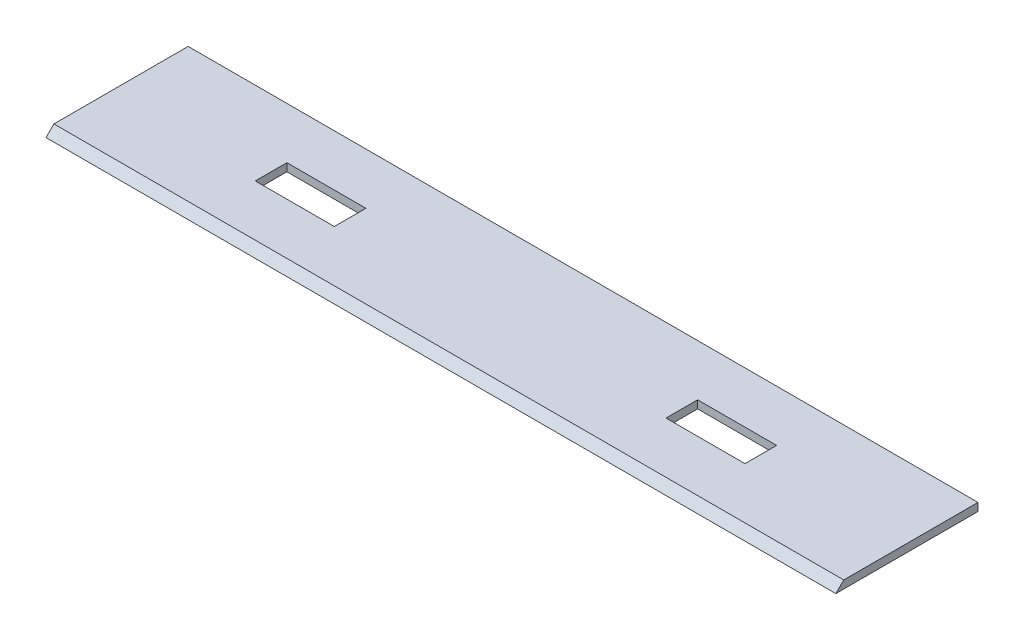
ISO-10303-21;
HEADER;
FILE_DESCRIPTION(('STEP AP214'),'2;1');
FILE_NAME('part.step','',(''),(''),'','','');
FILE_SCHEMA(('AUTOMOTIVE_DESIGN { 1 0 10303 214 1 1 1 1 }'));
ENDSEC;
DATA;
#1=APPLICATION_CONTEXT('core data for automotive mechanical design processes');
#2=APPLICATION_PROTOCOL_DEFINITION('international standard','automotive_design',2000,#1);
#3=PRODUCT_CONTEXT('',#1,'mechanical');
#4=PRODUCT('Part','Part','',(#3));
#5=PRODUCT_RELATED_PRODUCT_CATEGORY('part','',(#4));
#6=PRODUCT_DEFINITION_FORMATION('','',#4);
#7=PRODUCT_DEFINITION_CONTEXT('part definition',#1,'design');
#8=PRODUCT_DEFINITION('design','',#6,#7);
#9=PRODUCT_DEFINITION_SHAPE('','',#8);
#10=(LENGTH_UNIT() NAMED_UNIT(*) SI_UNIT(.MILLI.,.METRE.));
#11=(NAMED_UNIT(*) PLANE_ANGLE_UNIT() SI_UNIT($,.RADIAN.));
#12=(NAMED_UNIT(*) SI_UNIT($,.STERADIAN.) SOLID_ANGLE_UNIT());
#13=UNCERTAINTY_MEASURE_WITH_UNIT(LENGTH_MEASURE(1.E-05),#10,'distance_accuracy_value','');
#14=(GEOMETRIC_REPRESENTATION_CONTEXT(3) GLOBAL_UNCERTAINTY_ASSIGNED_CONTEXT((#13)) GLOBAL_UNIT_ASSIGNED_CONTEXT((#10,
#11,#12)) REPRESENTATION_CONTEXT('',''));
#15=CARTESIAN_POINT('',(0.,0.,0.));
#16=DIRECTION('',(0.,0.,1.));
#17=DIRECTION('',(1.,0.,0.));
#18=AXIS2_PLACEMENT_3D('',#15,#16,#17);
#19=CARTESIAN_POINT('',(50.,1.,9.));
#20=DIRECTION('',(-1.,0.,0.));
#21=DIRECTION('',(0.,0.,1.));
#22=AXIS2_PLACEMENT_3D('',#19,#20,#21);
#23=PLANE('',#22);
#24=DIRECTION('',(0.,0.,-1.));
#25=VECTOR('',#24,1.);
#26=CARTESIAN_POINT('',(50.,1.,9.));
#27=LINE('',#26,#25);
#28=CARTESIAN_POINT('',(50.,1.,8.));
#29=VERTEX_POINT('',#28);
#30=CARTESIAN_POINT('',(50.,1.,-9.));
#31=VERTEX_POINT('',#30);
#32=EDGE_CURVE('E193',#29,#31,#27,.T.);
#33=ORIENTED_EDGE('',*,*,#32,.F.);
#34=DIRECTION('',(0.,0.707106781186548,-0.707106781186548));
#35=VECTOR('',#34,1.);
#36=CARTESIAN_POINT('',(50.,1.,8.));
#37=LINE('',#36,#35);
#38=CARTESIAN_POINT('',(50.,0.,9.));
#39=VERTEX_POINT('',#38);
#40=EDGE_CURVE('E43',#29,#39,#37,.F.);
#41=ORIENTED_EDGE('',*,*,#40,.T.);
#42=DIRECTION('',(0.,0.,-1.));
#43=VECTOR('',#42,1.);
#44=CARTESIAN_POINT('',(50.,0.,9.));
#45=LINE('',#44,#43);
#46=CARTESIAN_POINT('',(50.,0.,-9.));
#47=VERTEX_POINT('',#46);
#48=EDGE_CURVE('E160',#39,#47,#45,.T.);
#49=ORIENTED_EDGE('',*,*,#48,.T.);
#50=DIRECTION('',(0.,-1.,0.));
#51=VECTOR('',#50,1.);
#52=CARTESIAN_POINT('',(50.,1.,-9.));
#53=LINE('',#52,#51);
#54=EDGE_CURVE('E212',#31,#47,#53,.T.);
#55=ORIENTED_EDGE('',*,*,#54,.F.);
#56=EDGE_LOOP('',(#33,#41,#49,#55));
#57=FACE_BOUND('',#56,.T.);
#58=ADVANCED_FACE('F35',(#57),#23,.F.);
#59=CARTESIAN_POINT('',(-50.,1.,-9.));
#60=DIRECTION('',(0.,0.,1.));
#61=DIRECTION('',(1.,0.,0.));
#62=AXIS2_PLACEMENT_3D('',#59,#60,#61);
#63=PLANE('',#62);
#64=DIRECTION('',(-1.,0.,0.));
#65=VECTOR('',#64,1.);
#66=CARTESIAN_POINT('',(-50.,0.,-9.));
#67=LINE('',#66,#65);
#68=CARTESIAN_POINT('',(-50.,0.,-9.));
#69=VERTEX_POINT('',#68);
#70=EDGE_CURVE('E204',#47,#69,#67,.T.);
#71=ORIENTED_EDGE('',*,*,#70,.T.);
#72=DIRECTION('',(0.,-1.,0.));
#73=VECTOR('',#72,1.);
#74=CARTESIAN_POINT('',(-50.,1.,-9.));
#75=LINE('',#74,#73);
#76=CARTESIAN_POINT('',(-50.,1.,-9.));
#77=VERTEX_POINT('',#76);
#78=EDGE_CURVE('E201',#77,#69,#75,.T.);
#79=ORIENTED_EDGE('',*,*,#78,.F.);
#80=DIRECTION('',(-1.,0.,0.));
#81=VECTOR('',#80,1.);
#82=CARTESIAN_POINT('',(-50.,1.,-9.));
#83=LINE('',#82,#81);
#84=EDGE_CURVE('E195',#31,#77,#83,.T.);
#85=ORIENTED_EDGE('',*,*,#84,.F.);
#86=ORIENTED_EDGE('',*,*,#54,.T.);
#87=EDGE_LOOP('',(#71,#79,#85,#86));
#88=FACE_BOUND('',#87,.T.);
#89=ADVANCED_FACE('F235',(#88),#63,.F.);
#90=CARTESIAN_POINT('',(-50.,1.,9.));
#91=DIRECTION('',(1.,0.,0.));
#92=DIRECTION('',(0.,0.,-1.));
#93=AXIS2_PLACEMENT_3D('',#90,#91,#92);
#94=PLANE('',#93);
#95=DIRECTION('',(0.,0.,1.));
#96=VECTOR('',#95,1.);
#97=CARTESIAN_POINT('',(-50.,0.,9.));
#98=LINE('',#97,#96);
#99=CARTESIAN_POINT('',(-50.,0.,9.));
#100=VERTEX_POINT('',#99);
#101=EDGE_CURVE('E206',#69,#100,#98,.T.);
#102=ORIENTED_EDGE('',*,*,#101,.T.);
#103=DIRECTION('',(0.,-0.707106781186548,0.707106781186548));
#104=VECTOR('',#103,1.);
#105=CARTESIAN_POINT('',(-50.,1.,8.));
#106=LINE('',#105,#104);
#107=CARTESIAN_POINT('',(-50.,1.,8.));
#108=VERTEX_POINT('',#107);
#109=EDGE_CURVE('E11',#100,#108,#106,.F.);
#110=ORIENTED_EDGE('',*,*,#109,.T.);
#111=DIRECTION('',(0.,0.,1.));
#112=VECTOR('',#111,1.);
#113=CARTESIAN_POINT('',(-50.,1.,9.));
#114=LINE('',#113,#112);
#115=EDGE_CURVE('E198',#77,#108,#114,.T.);
#116=ORIENTED_EDGE('',*,*,#115,.F.);
#117=ORIENTED_EDGE('',*,*,#78,.T.);
#118=EDGE_LOOP('',(#102,#110,#116,#117));
#119=FACE_BOUND('',#118,.T.);
#120=ADVANCED_FACE('F229',(#119),#94,.F.);
#121=CARTESIAN_POINT('',(0.,1.,0.));
#122=DIRECTION('',(0.,-1.,0.));
#123=DIRECTION('',(0.,0.,-1.));
#124=AXIS2_PLACEMENT_3D('',#121,#122,#123);
#125=PLANE('',#124);
#126=DIRECTION('',(-1.,0.,0.));
#127=VECTOR('',#126,1.);
#128=CARTESIAN_POINT('',(-31.,1.,-2.50000000000001));
#129=LINE('',#128,#127);
#130=CARTESIAN_POINT('',(-21.,1.,-2.50000000000001));
#131=VERTEX_POINT('',#130);
#132=CARTESIAN_POINT('',(-31.,1.,-2.50000000000001));
#133=VERTEX_POINT('',#132);
#134=EDGE_CURVE('E153',#131,#133,#129,.T.);
#135=ORIENTED_EDGE('',*,*,#134,.F.);
#136=DIRECTION('',(0.,0.,-1.));
#137=VECTOR('',#136,1.);
#138=CARTESIAN_POINT('',(-21.,1.,-2.50000000000001));
#139=LINE('',#138,#137);
#140=CARTESIAN_POINT('',(-21.,1.,1.49999999999999));
#141=VERTEX_POINT('',#140);
#142=EDGE_CURVE('E50',#141,#131,#139,.T.);
#143=ORIENTED_EDGE('',*,*,#142,.F.);
#144=DIRECTION('',(1.,0.,0.));
#145=VECTOR('',#144,1.);
#146=CARTESIAN_POINT('',(-31.,1.,1.49999999999999));
#147=LINE('',#146,#145);
#148=CARTESIAN_POINT('',(-31.,1.,1.49999999999999));
#149=VERTEX_POINT('',#148);
#150=EDGE_CURVE('E144',#149,#141,#147,.T.);
#151=ORIENTED_EDGE('',*,*,#150,.F.);
#152=DIRECTION('',(0.,0.,1.));
#153=VECTOR('',#152,1.);
#154=CARTESIAN_POINT('',(-31.,1.,-2.50000000000001));
#155=LINE('',#154,#153);
#156=EDGE_CURVE('E147',#133,#149,#155,.T.);
#157=ORIENTED_EDGE('',*,*,#156,.F.);
#158=EDGE_LOOP('',(#135,#143,#151,#157));
#159=FACE_BOUND('',#158,.T.);
#160=DIRECTION('',(-1.,0.,0.));
#161=VECTOR('',#160,1.);
#162=CARTESIAN_POINT('',(21.,1.,-2.50000000000001));
#163=LINE('',#162,#161);
#164=CARTESIAN_POINT('',(31.,1.,-2.50000000000001));
#165=VERTEX_POINT('',#164);
#166=CARTESIAN_POINT('',(21.,1.,-2.50000000000001));
#167=VERTEX_POINT('',#166);
#168=EDGE_CURVE('E179',#165,#167,#163,.T.);
#169=ORIENTED_EDGE('',*,*,#168,.F.);
#170=DIRECTION('',(0.,0.,-1.));
#171=VECTOR('',#170,1.);
#172=CARTESIAN_POINT('',(31.,1.,-2.50000000000001));
#173=LINE('',#172,#171);
#174=CARTESIAN_POINT('',(31.,1.,1.49999999999999));
#175=VERTEX_POINT('',#174);
#176=EDGE_CURVE('E58',#175,#165,#173,.T.);
#177=ORIENTED_EDGE('',*,*,#176,.F.);
#178=DIRECTION('',(1.,0.,0.));
#179=VECTOR('',#178,1.);
#180=CARTESIAN_POINT('',(21.,1.,1.49999999999999));
#181=LINE('',#180,#179);
#182=CARTESIAN_POINT('',(21.,1.,1.49999999999999));
#183=VERTEX_POINT('',#182);
#184=EDGE_CURVE('E168',#183,#175,#181,.T.);
#185=ORIENTED_EDGE('',*,*,#184,.F.);
#186=DIRECTION('',(0.,0.,1.));
#187=VECTOR('',#186,1.);
#188=CARTESIAN_POINT('',(21.,1.,-2.50000000000001));
#189=LINE('',#188,#187);
#190=EDGE_CURVE('E182',#167,#183,#189,.T.);
#191=ORIENTED_EDGE('',*,*,#190,.F.);
#192=EDGE_LOOP('',(#169,#177,#185,#191));
#193=FACE_BOUND('',#192,.T.);
#194=ORIENTED_EDGE('',*,*,#115,.T.);
#195=DIRECTION('',(1.,0.,0.));
#196=VECTOR('',#195,1.);
#197=CARTESIAN_POINT('',(0.,1.,8.));
#198=LINE('',#197,#196);
#199=EDGE_CURVE('E215',#108,#29,#198,.T.);
#200=ORIENTED_EDGE('',*,*,#199,.T.);
#201=ORIENTED_EDGE('',*,*,#32,.T.);
#202=ORIENTED_EDGE('',*,*,#84,.T.);
#203=EDGE_LOOP('',(#194,#200,#201,#202));
#204=FACE_BOUND('',#203,.T.);
#205=ADVANCED_FACE('F231',(#159,#193,#204),#125,.F.);
#206=CARTESIAN_POINT('',(0.,0.,0.));
#207=DIRECTION('',(0.,-1.,0.));
#208=DIRECTION('',(0.,0.,-1.));
#209=AXIS2_PLACEMENT_3D('',#206,#207,#208);
#210=PLANE('',#209);
#211=DIRECTION('',(0.,0.,-1.));
#212=VECTOR('',#211,1.);
#213=CARTESIAN_POINT('',(-21.,0.,-2.50000000000001));
#214=LINE('',#213,#212);
#215=CARTESIAN_POINT('',(-21.,0.,1.49999999999999));
#216=VERTEX_POINT('',#215);
#217=CARTESIAN_POINT('',(-21.,0.,-2.50000000000001));
#218=VERTEX_POINT('',#217);
#219=EDGE_CURVE('E125',#216,#218,#214,.T.);
#220=ORIENTED_EDGE('',*,*,#219,.T.);
#221=DIRECTION('',(-1.,0.,0.));
#222=VECTOR('',#221,1.);
#223=CARTESIAN_POINT('',(-31.,0.,-2.50000000000001));
#224=LINE('',#223,#222);
#225=CARTESIAN_POINT('',(-31.,0.,-2.50000000000001));
#226=VERTEX_POINT('',#225);
#227=EDGE_CURVE('E135',#218,#226,#224,.T.);
#228=ORIENTED_EDGE('',*,*,#227,.T.);
#229=DIRECTION('',(0.,0.,1.));
#230=VECTOR('',#229,1.);
#231=CARTESIAN_POINT('',(-31.,0.,-2.50000000000001));
#232=LINE('',#231,#230);
#233=CARTESIAN_POINT('',(-31.,0.,1.49999999999999));
#234=VERTEX_POINT('',#233);
#235=EDGE_CURVE('E139',#226,#234,#232,.T.);
#236=ORIENTED_EDGE('',*,*,#235,.T.);
#237=DIRECTION('',(1.,0.,0.));
#238=VECTOR('',#237,1.);
#239=CARTESIAN_POINT('',(-31.,0.,1.49999999999999));
#240=LINE('',#239,#238);
#241=EDGE_CURVE('E131',#234,#216,#240,.T.);
#242=ORIENTED_EDGE('',*,*,#241,.T.);
#243=EDGE_LOOP('',(#220,#228,#236,#242));
#244=FACE_BOUND('',#243,.T.);
#245=DIRECTION('',(0.,0.,-1.));
#246=VECTOR('',#245,1.);
#247=CARTESIAN_POINT('',(31.,0.,-2.50000000000001));
#248=LINE('',#247,#246);
#249=CARTESIAN_POINT('',(31.,0.,1.49999999999999));
#250=VERTEX_POINT('',#249);
#251=CARTESIAN_POINT('',(31.,0.,-2.50000000000001));
#252=VERTEX_POINT('',#251);
#253=EDGE_CURVE('E164',#250,#252,#248,.T.);
#254=ORIENTED_EDGE('',*,*,#253,.T.);
#255=DIRECTION('',(-1.,0.,0.));
#256=VECTOR('',#255,1.);
#257=CARTESIAN_POINT('',(21.,0.,-2.50000000000001));
#258=LINE('',#257,#256);
#259=CARTESIAN_POINT('',(21.,0.,-2.50000000000001));
#260=VERTEX_POINT('',#259);
#261=EDGE_CURVE('E167',#252,#260,#258,.T.);
#262=ORIENTED_EDGE('',*,*,#261,.T.);
#263=DIRECTION('',(0.,0.,1.));
#264=VECTOR('',#263,1.);
#265=CARTESIAN_POINT('',(21.,0.,-2.50000000000001));
#266=LINE('',#265,#264);
#267=CARTESIAN_POINT('',(21.,0.,1.49999999999999));
#268=VERTEX_POINT('',#267);
#269=EDGE_CURVE('E171',#260,#268,#266,.T.);
#270=ORIENTED_EDGE('',*,*,#269,.T.);
#271=DIRECTION('',(1.,0.,0.));
#272=VECTOR('',#271,1.);
#273=CARTESIAN_POINT('',(21.,0.,1.49999999999999));
#274=LINE('',#273,#272);
#275=EDGE_CURVE('E174',#268,#250,#274,.T.);
#276=ORIENTED_EDGE('',*,*,#275,.T.);
#277=EDGE_LOOP('',(#254,#262,#270,#276));
#278=FACE_BOUND('',#277,.T.);
#279=ORIENTED_EDGE('',*,*,#48,.F.);
#280=DIRECTION('',(1.,0.,0.));
#281=VECTOR('',#280,1.);
#282=CARTESIAN_POINT('',(-50.,0.,9.));
#283=LINE('',#282,#281);
#284=EDGE_CURVE('E196',#100,#39,#283,.T.);
#285=ORIENTED_EDGE('',*,*,#284,.F.);
#286=ORIENTED_EDGE('',*,*,#101,.F.);
#287=ORIENTED_EDGE('',*,*,#70,.F.);
#288=EDGE_LOOP('',(#279,#285,#286,#287));
#289=FACE_BOUND('',#288,.T.);
#290=ADVANCED_FACE('F141',(#244,#278,#289),#210,.T.);
#291=CARTESIAN_POINT('',(0.,1.,8.));
#292=DIRECTION('',(0.,-0.707106781186547,-0.707106781186547));
#293=DIRECTION('',(1.,0.,0.));
#294=AXIS2_PLACEMENT_3D('',#291,#292,#293);
#295=PLANE('',#294);
#296=ORIENTED_EDGE('',*,*,#109,.F.);
#297=ORIENTED_EDGE('',*,*,#284,.T.);
#298=ORIENTED_EDGE('',*,*,#40,.F.);
#299=ORIENTED_EDGE('',*,*,#199,.F.);
#300=EDGE_LOOP('',(#296,#297,#298,#299));
#301=FACE_BOUND('',#300,.T.);
#302=ADVANCED_FACE('F37',(#301),#295,.F.);
#303=CARTESIAN_POINT('',(31.,0.,-2.50000000000001));
#304=DIRECTION('',(1.,0.,0.));
#305=DIRECTION('',(0.,0.,-1.));
#306=AXIS2_PLACEMENT_3D('',#303,#304,#305);
#307=PLANE('',#306);
#308=ORIENTED_EDGE('',*,*,#176,.T.);
#309=DIRECTION('',(0.,1.,0.));
#310=VECTOR('',#309,1.);
#311=CARTESIAN_POINT('',(31.,0.,-2.50000000000001));
#312=LINE('',#311,#310);
#313=EDGE_CURVE('E177',#252,#165,#312,.T.);
#314=ORIENTED_EDGE('',*,*,#313,.F.);
#315=ORIENTED_EDGE('',*,*,#253,.F.);
#316=DIRECTION('',(0.,1.,0.));
#317=VECTOR('',#316,1.);
#318=CARTESIAN_POINT('',(31.,0.,1.49999999999999));
#319=LINE('',#318,#317);
#320=EDGE_CURVE('E154',#250,#175,#319,.T.);
#321=ORIENTED_EDGE('',*,*,#320,.T.);
#322=EDGE_LOOP('',(#308,#314,#315,#321));
#323=FACE_BOUND('',#322,.T.);
#324=ADVANCED_FACE('F249',(#323),#307,.F.);
#325=CARTESIAN_POINT('',(21.,0.,1.49999999999999));
#326=DIRECTION('',(0.,0.,1.));
#327=DIRECTION('',(1.,0.,0.));
#328=AXIS2_PLACEMENT_3D('',#325,#326,#327);
#329=PLANE('',#328);
#330=ORIENTED_EDGE('',*,*,#184,.T.);
#331=ORIENTED_EDGE('',*,*,#320,.F.);
#332=ORIENTED_EDGE('',*,*,#275,.F.);
#333=DIRECTION('',(0.,1.,0.));
#334=VECTOR('',#333,1.);
#335=CARTESIAN_POINT('',(21.,0.,1.49999999999999));
#336=LINE('',#335,#334);
#337=EDGE_CURVE('E188',#268,#183,#336,.T.);
#338=ORIENTED_EDGE('',*,*,#337,.T.);
#339=EDGE_LOOP('',(#330,#331,#332,#338));
#340=FACE_BOUND('',#339,.T.);
#341=ADVANCED_FACE('F252',(#340),#329,.F.);
#342=CARTESIAN_POINT('',(21.,0.,-2.50000000000001));
#343=DIRECTION('',(-1.,0.,0.));
#344=DIRECTION('',(0.,0.,1.));
#345=AXIS2_PLACEMENT_3D('',#342,#343,#344);
#346=PLANE('',#345);
#347=ORIENTED_EDGE('',*,*,#190,.T.);
#348=ORIENTED_EDGE('',*,*,#337,.F.);
#349=ORIENTED_EDGE('',*,*,#269,.F.);
#350=DIRECTION('',(0.,1.,0.));
#351=VECTOR('',#350,1.);
#352=CARTESIAN_POINT('',(21.,0.,-2.50000000000001));
#353=LINE('',#352,#351);
#354=EDGE_CURVE('E190',#260,#167,#353,.T.);
#355=ORIENTED_EDGE('',*,*,#354,.T.);
#356=EDGE_LOOP('',(#347,#348,#349,#355));
#357=FACE_BOUND('',#356,.T.);
#358=ADVANCED_FACE('F256',(#357),#346,.F.);
#359=CARTESIAN_POINT('',(21.,0.,-2.50000000000001));
#360=DIRECTION('',(0.,0.,-1.));
#361=DIRECTION('',(-1.,0.,0.));
#362=AXIS2_PLACEMENT_3D('',#359,#360,#361);
#363=PLANE('',#362);
#364=ORIENTED_EDGE('',*,*,#168,.T.);
#365=ORIENTED_EDGE('',*,*,#354,.F.);
#366=ORIENTED_EDGE('',*,*,#261,.F.);
#367=ORIENTED_EDGE('',*,*,#313,.T.);
#368=EDGE_LOOP('',(#364,#365,#366,#367));
#369=FACE_BOUND('',#368,.T.);
#370=ADVANCED_FACE('F253',(#369),#363,.F.);
#371=CARTESIAN_POINT('',(-21.,0.,-2.50000000000001));
#372=DIRECTION('',(1.,0.,0.));
#373=DIRECTION('',(0.,0.,-1.));
#374=AXIS2_PLACEMENT_3D('',#371,#372,#373);
#375=PLANE('',#374);
#376=ORIENTED_EDGE('',*,*,#142,.T.);
#377=DIRECTION('',(0.,1.,0.));
#378=VECTOR('',#377,1.);
#379=CARTESIAN_POINT('',(-21.,0.,-2.50000000000001));
#380=LINE('',#379,#378);
#381=EDGE_CURVE('E121',#218,#131,#380,.T.);
#382=ORIENTED_EDGE('',*,*,#381,.F.);
#383=ORIENTED_EDGE('',*,*,#219,.F.);
#384=DIRECTION('',(0.,1.,0.));
#385=VECTOR('',#384,1.);
#386=CARTESIAN_POINT('',(-21.,0.,1.49999999999999));
#387=LINE('',#386,#385);
#388=EDGE_CURVE('E158',#216,#141,#387,.T.);
#389=ORIENTED_EDGE('',*,*,#388,.T.);
#390=EDGE_LOOP('',(#376,#382,#383,#389));
#391=FACE_BOUND('',#390,.T.);
#392=ADVANCED_FACE('F123',(#391),#375,.F.);
#393=CARTESIAN_POINT('',(-31.,0.,1.49999999999999));
#394=DIRECTION('',(0.,0.,1.));
#395=DIRECTION('',(1.,0.,0.));
#396=AXIS2_PLACEMENT_3D('',#393,#394,#395);
#397=PLANE('',#396);
#398=ORIENTED_EDGE('',*,*,#150,.T.);
#399=ORIENTED_EDGE('',*,*,#388,.F.);
#400=ORIENTED_EDGE('',*,*,#241,.F.);
#401=DIRECTION('',(0.,1.,0.));
#402=VECTOR('',#401,1.);
#403=CARTESIAN_POINT('',(-31.,0.,1.49999999999999));
#404=LINE('',#403,#402);
#405=EDGE_CURVE('E161',#234,#149,#404,.T.);
#406=ORIENTED_EDGE('',*,*,#405,.T.);
#407=EDGE_LOOP('',(#398,#399,#400,#406));
#408=FACE_BOUND('',#407,.T.);
#409=ADVANCED_FACE('F266',(#408),#397,.F.);
#410=CARTESIAN_POINT('',(-31.,0.,-2.50000000000001));
#411=DIRECTION('',(-1.,0.,0.));
#412=DIRECTION('',(0.,0.,1.));
#413=AXIS2_PLACEMENT_3D('',#410,#411,#412);
#414=PLANE('',#413);
#415=ORIENTED_EDGE('',*,*,#156,.T.);
#416=ORIENTED_EDGE('',*,*,#405,.F.);
#417=ORIENTED_EDGE('',*,*,#235,.F.);
#418=DIRECTION('',(0.,1.,0.));
#419=VECTOR('',#418,1.);
#420=CARTESIAN_POINT('',(-31.,0.,-2.50000000000001));
#421=LINE('',#420,#419);
#422=EDGE_CURVE('E130',#226,#133,#421,.T.);
#423=ORIENTED_EDGE('',*,*,#422,.T.);
#424=EDGE_LOOP('',(#415,#416,#417,#423));
#425=FACE_BOUND('',#424,.T.);
#426=ADVANCED_FACE('F269',(#425),#414,.F.);
#427=CARTESIAN_POINT('',(-31.,0.,-2.50000000000001));
#428=DIRECTION('',(0.,0.,-1.));
#429=DIRECTION('',(-1.,0.,0.));
#430=AXIS2_PLACEMENT_3D('',#427,#428,#429);
#431=PLANE('',#430);
#432=ORIENTED_EDGE('',*,*,#134,.T.);
#433=ORIENTED_EDGE('',*,*,#422,.F.);
#434=ORIENTED_EDGE('',*,*,#227,.F.);
#435=ORIENTED_EDGE('',*,*,#381,.T.);
#436=EDGE_LOOP('',(#432,#433,#434,#435));
#437=FACE_BOUND('',#436,.T.);
#438=ADVANCED_FACE('F136',(#437),#431,.F.);
#439=CLOSED_SHELL('',(#58,#89,#120,#205,#290,#302,#324,#341,#358,#370,#392,#409,#426,#438));
#440=MANIFOLD_SOLID_BREP('B2',#439);
#441=ADVANCED_BREP_SHAPE_REPRESENTATION('',(#18,#440),#14);
#442=SHAPE_DEFINITION_REPRESENTATION(#9,#441);
ENDSEC;
END-ISO-10303-21;
